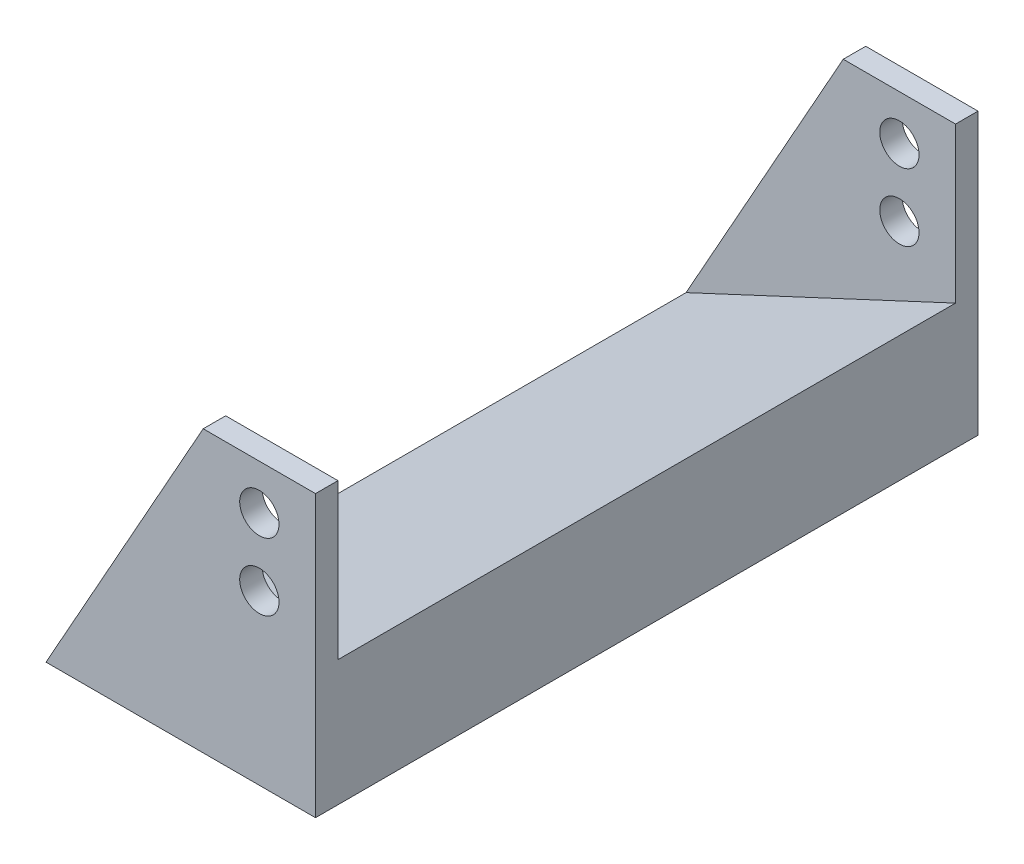
ISO-10303-21;
HEADER;
FILE_DESCRIPTION(('STEP AP214'),'2;1');
FILE_NAME('part.step','',(''),(''),'','','');
FILE_SCHEMA(('AUTOMOTIVE_DESIGN { 1 0 10303 214 1 1 1 1 }'));
ENDSEC;
DATA;
#1=APPLICATION_CONTEXT('core data for automotive mechanical design processes');
#2=APPLICATION_PROTOCOL_DEFINITION('international standard','automotive_design',2000,#1);
#3=PRODUCT_CONTEXT('',#1,'mechanical');
#4=PRODUCT('Part','Part','',(#3));
#5=PRODUCT_RELATED_PRODUCT_CATEGORY('part','',(#4));
#6=PRODUCT_DEFINITION_FORMATION('','',#4);
#7=PRODUCT_DEFINITION_CONTEXT('part definition',#1,'design');
#8=PRODUCT_DEFINITION('design','',#6,#7);
#9=PRODUCT_DEFINITION_SHAPE('','',#8);
#10=(LENGTH_UNIT() NAMED_UNIT(*) SI_UNIT(.MILLI.,.METRE.));
#11=(NAMED_UNIT(*) PLANE_ANGLE_UNIT() SI_UNIT($,.RADIAN.));
#12=(NAMED_UNIT(*) SI_UNIT($,.STERADIAN.) SOLID_ANGLE_UNIT());
#13=UNCERTAINTY_MEASURE_WITH_UNIT(LENGTH_MEASURE(1.E-05),#10,'distance_accuracy_value','');
#14=(GEOMETRIC_REPRESENTATION_CONTEXT(3) GLOBAL_UNCERTAINTY_ASSIGNED_CONTEXT((#13)) GLOBAL_UNIT_ASSIGNED_CONTEXT((#10,
#11,#12)) REPRESENTATION_CONTEXT('',''));
#15=CARTESIAN_POINT('',(0.,0.,0.));
#16=DIRECTION('',(0.,0.,1.));
#17=DIRECTION('',(1.,0.,0.));
#18=AXIS2_PLACEMENT_3D('',#15,#16,#17);
#19=CARTESIAN_POINT('',(24.,11.1913837957198,27.5));
#20=DIRECTION('',(0.422618261740694,-0.906307787036653,0.));
#21=DIRECTION('',(0.906307787036653,0.422618261740694,0.));
#22=AXIS2_PLACEMENT_3D('',#19,#20,#21);
#23=PLANE('',#22);
#24=DIRECTION('',(-0.906307787036653,-0.422618261740694,0.));
#25=VECTOR('',#24,1.);
#26=CARTESIAN_POINT('',(24.,11.1913837957198,-27.5));
#27=LINE('',#26,#25);
#28=CARTESIAN_POINT('',(24.,11.1913837957198,-27.5));
#29=VERTEX_POINT('',#28);
#30=CARTESIAN_POINT('',(0.,0.,-27.5));
#31=VERTEX_POINT('',#30);
#32=EDGE_CURVE('E174',#29,#31,#27,.T.);
#33=ORIENTED_EDGE('',*,*,#32,.T.);
#34=DIRECTION('',(0.,0.,-1.));
#35=VECTOR('',#34,1.);
#36=CARTESIAN_POINT('',(0.,0.,27.5));
#37=LINE('',#36,#35);
#38=CARTESIAN_POINT('',(0.,0.,27.5));
#39=VERTEX_POINT('',#38);
#40=EDGE_CURVE('E11',#39,#31,#37,.T.);
#41=ORIENTED_EDGE('',*,*,#40,.F.);
#42=DIRECTION('',(-0.906307787036653,-0.422618261740694,0.));
#43=VECTOR('',#42,1.);
#44=CARTESIAN_POINT('',(24.,11.1913837957198,27.5));
#45=LINE('',#44,#43);
#46=CARTESIAN_POINT('',(24.,11.1913837957198,27.5));
#47=VERTEX_POINT('',#46);
#48=EDGE_CURVE('E175',#47,#39,#45,.T.);
#49=ORIENTED_EDGE('',*,*,#48,.F.);
#50=DIRECTION('',(0.,0.,-1.));
#51=VECTOR('',#50,1.);
#52=CARTESIAN_POINT('',(24.,11.1913837957198,27.5));
#53=LINE('',#52,#51);
#54=EDGE_CURVE('E51',#47,#29,#53,.T.);
#55=ORIENTED_EDGE('',*,*,#54,.T.);
#56=EDGE_LOOP('',(#33,#41,#49,#55));
#57=FACE_BOUND('',#56,.T.);
#58=ADVANCED_FACE('F37',(#57),#23,.F.);
#59=CARTESIAN_POINT('',(0.,0.,27.5));
#60=DIRECTION('',(0.,1.,0.));
#61=DIRECTION('',(0.,0.,1.));
#62=AXIS2_PLACEMENT_3D('',#59,#60,#61);
#63=PLANE('',#62);
#64=ORIENTED_EDGE('',*,*,#40,.T.);
#65=DIRECTION('',(0.,0.,1.));
#66=VECTOR('',#65,1.);
#67=CARTESIAN_POINT('',(0.,0.,-29.5));
#68=LINE('',#67,#66);
#69=CARTESIAN_POINT('',(0.,0.,-29.5));
#70=VERTEX_POINT('',#69);
#71=EDGE_CURVE('E98',#70,#31,#68,.T.);
#72=ORIENTED_EDGE('',*,*,#71,.F.);
#73=DIRECTION('',(1.,0.,0.));
#74=VECTOR('',#73,1.);
#75=CARTESIAN_POINT('',(0.,0.,-29.5));
#76=LINE('',#75,#74);
#77=CARTESIAN_POINT('',(24.,0.,-29.5));
#78=VERTEX_POINT('',#77);
#79=EDGE_CURVE('E101',#70,#78,#76,.T.);
#80=ORIENTED_EDGE('',*,*,#79,.T.);
#81=DIRECTION('',(0.,0.,-1.));
#82=VECTOR('',#81,1.);
#83=CARTESIAN_POINT('',(24.,0.,27.5));
#84=LINE('',#83,#82);
#85=CARTESIAN_POINT('',(24.,0.,29.5));
#86=VERTEX_POINT('',#85);
#87=EDGE_CURVE('E45',#86,#78,#84,.T.);
#88=ORIENTED_EDGE('',*,*,#87,.F.);
#89=DIRECTION('',(1.,0.,0.));
#90=VECTOR('',#89,1.);
#91=CARTESIAN_POINT('',(0.,0.,29.5));
#92=LINE('',#91,#90);
#93=CARTESIAN_POINT('',(0.,0.,29.5));
#94=VERTEX_POINT('',#93);
#95=EDGE_CURVE('E151',#94,#86,#92,.T.);
#96=ORIENTED_EDGE('',*,*,#95,.F.);
#97=DIRECTION('',(0.,0.,-1.));
#98=VECTOR('',#97,1.);
#99=CARTESIAN_POINT('',(0.,0.,29.5));
#100=LINE('',#99,#98);
#101=EDGE_CURVE('E161',#94,#39,#100,.T.);
#102=ORIENTED_EDGE('',*,*,#101,.T.);
#103=EDGE_LOOP('',(#64,#72,#80,#88,#96,#102));
#104=FACE_BOUND('',#103,.T.);
#105=ADVANCED_FACE('F100',(#104),#63,.F.);
#106=CARTESIAN_POINT('',(24.,0.,27.5));
#107=DIRECTION('',(-1.,0.,0.));
#108=DIRECTION('',(0.,0.,1.));
#109=AXIS2_PLACEMENT_3D('',#106,#107,#108);
#110=PLANE('',#109);
#111=ORIENTED_EDGE('',*,*,#87,.T.);
#112=DIRECTION('',(0.,1.,0.));
#113=VECTOR('',#112,1.);
#114=CARTESIAN_POINT('',(24.,0.,-29.5));
#115=LINE('',#114,#113);
#116=CARTESIAN_POINT('',(24.,25.,-29.5));
#117=VERTEX_POINT('',#116);
#118=EDGE_CURVE('E118',#78,#117,#115,.T.);
#119=ORIENTED_EDGE('',*,*,#118,.T.);
#120=DIRECTION('',(0.,0.,1.));
#121=VECTOR('',#120,1.);
#122=CARTESIAN_POINT('',(24.,25.,-29.5));
#123=LINE('',#122,#121);
#124=CARTESIAN_POINT('',(24.,25.,-27.5));
#125=VERTEX_POINT('',#124);
#126=EDGE_CURVE('E128',#117,#125,#123,.T.);
#127=ORIENTED_EDGE('',*,*,#126,.T.);
#128=DIRECTION('',(0.,1.,0.));
#129=VECTOR('',#128,1.);
#130=CARTESIAN_POINT('',(24.,0.,-27.5));
#131=LINE('',#130,#129);
#132=EDGE_CURVE('E119',#29,#125,#131,.T.);
#133=ORIENTED_EDGE('',*,*,#132,.F.);
#134=ORIENTED_EDGE('',*,*,#54,.F.);
#135=DIRECTION('',(0.,1.,0.));
#136=VECTOR('',#135,1.);
#137=CARTESIAN_POINT('',(24.,0.,27.5));
#138=LINE('',#137,#136);
#139=CARTESIAN_POINT('',(24.,25.,27.5));
#140=VERTEX_POINT('',#139);
#141=EDGE_CURVE('E148',#47,#140,#138,.T.);
#142=ORIENTED_EDGE('',*,*,#141,.T.);
#143=DIRECTION('',(0.,0.,-1.));
#144=VECTOR('',#143,1.);
#145=CARTESIAN_POINT('',(24.,25.,29.5));
#146=LINE('',#145,#144);
#147=CARTESIAN_POINT('',(24.,25.,29.5));
#148=VERTEX_POINT('',#147);
#149=EDGE_CURVE('E171',#148,#140,#146,.T.);
#150=ORIENTED_EDGE('',*,*,#149,.F.);
#151=DIRECTION('',(0.,1.,0.));
#152=VECTOR('',#151,1.);
#153=CARTESIAN_POINT('',(24.,0.,29.5));
#154=LINE('',#153,#152);
#155=EDGE_CURVE('E154',#86,#148,#154,.T.);
#156=ORIENTED_EDGE('',*,*,#155,.F.);
#157=EDGE_LOOP('',(#111,#119,#127,#133,#134,#142,#150,#156));
#158=FACE_BOUND('',#157,.T.);
#159=ADVANCED_FACE('F180',(#158),#110,.F.);
#160=CARTESIAN_POINT('',(0.,0.,27.5));
#161=DIRECTION('',(0.,0.,1.));
#162=DIRECTION('',(1.,0.,0.));
#163=AXIS2_PLACEMENT_3D('',#160,#161,#162);
#164=PLANE('',#163);
#165=CARTESIAN_POINT('',(19.,21.,27.5));
#166=DIRECTION('',(0.,0.,1.));
#167=DIRECTION('',(1.,0.,0.));
#168=AXIS2_PLACEMENT_3D('',#165,#166,#167);
#169=CIRCLE('',#168,1.75);
#170=CARTESIAN_POINT('',(20.75,21.,27.5));
#171=VERTEX_POINT('',#170);
#172=EDGE_CURVE('E142',#171,#171,#169,.T.);
#173=ORIENTED_EDGE('',*,*,#172,.T.);
#174=EDGE_LOOP('',(#173));
#175=FACE_BOUND('',#174,.T.);
#176=CARTESIAN_POINT('',(19.,15.,27.5));
#177=DIRECTION('',(0.,0.,1.));
#178=DIRECTION('',(1.,0.,0.));
#179=AXIS2_PLACEMENT_3D('',#176,#177,#178);
#180=CIRCLE('',#179,1.75);
#181=CARTESIAN_POINT('',(20.75,15.,27.5));
#182=VERTEX_POINT('',#181);
#183=EDGE_CURVE('E108',#182,#182,#180,.T.);
#184=ORIENTED_EDGE('',*,*,#183,.T.);
#185=EDGE_LOOP('',(#184));
#186=FACE_BOUND('',#185,.T.);
#187=ORIENTED_EDGE('',*,*,#141,.F.);
#188=ORIENTED_EDGE('',*,*,#48,.T.);
#189=DIRECTION('',(-0.488603368931843,-0.87250601594972,0.));
#190=VECTOR('',#189,1.);
#191=CARTESIAN_POINT('',(14.,25.,27.5));
#192=LINE('',#191,#190);
#193=CARTESIAN_POINT('',(14.,25.,27.5));
#194=VERTEX_POINT('',#193);
#195=EDGE_CURVE('E155',#194,#39,#192,.T.);
#196=ORIENTED_EDGE('',*,*,#195,.F.);
#197=DIRECTION('',(-1.,0.,0.));
#198=VECTOR('',#197,1.);
#199=CARTESIAN_POINT('',(24.,25.,27.5));
#200=LINE('',#199,#198);
#201=EDGE_CURVE('E163',#140,#194,#200,.T.);
#202=ORIENTED_EDGE('',*,*,#201,.F.);
#203=EDGE_LOOP('',(#187,#188,#196,#202));
#204=FACE_BOUND('',#203,.T.);
#205=ADVANCED_FACE('F196',(#175,#186,#204),#164,.F.);
#206=CARTESIAN_POINT('',(0.,0.,29.5));
#207=DIRECTION('',(0.,0.,1.));
#208=DIRECTION('',(1.,0.,0.));
#209=AXIS2_PLACEMENT_3D('',#206,#207,#208);
#210=PLANE('',#209);
#211=CARTESIAN_POINT('',(19.,21.,29.5));
#212=DIRECTION('',(0.,0.,1.));
#213=DIRECTION('',(1.,0.,0.));
#214=AXIS2_PLACEMENT_3D('',#211,#212,#213);
#215=CIRCLE('',#214,1.75);
#216=CARTESIAN_POINT('',(20.75,21.,29.5));
#217=VERTEX_POINT('',#216);
#218=EDGE_CURVE('E145',#217,#217,#215,.T.);
#219=ORIENTED_EDGE('',*,*,#218,.F.);
#220=EDGE_LOOP('',(#219));
#221=FACE_BOUND('',#220,.T.);
#222=ORIENTED_EDGE('',*,*,#95,.T.);
#223=ORIENTED_EDGE('',*,*,#155,.T.);
#224=DIRECTION('',(-1.,0.,0.));
#225=VECTOR('',#224,1.);
#226=CARTESIAN_POINT('',(24.,25.,29.5));
#227=LINE('',#226,#225);
#228=CARTESIAN_POINT('',(14.,25.,29.5));
#229=VERTEX_POINT('',#228);
#230=EDGE_CURVE('E157',#148,#229,#227,.T.);
#231=ORIENTED_EDGE('',*,*,#230,.T.);
#232=DIRECTION('',(-0.488603368931843,-0.87250601594972,0.));
#233=VECTOR('',#232,1.);
#234=CARTESIAN_POINT('',(14.,25.,29.5));
#235=LINE('',#234,#233);
#236=EDGE_CURVE('E159',#229,#94,#235,.T.);
#237=ORIENTED_EDGE('',*,*,#236,.T.);
#238=EDGE_LOOP('',(#222,#223,#231,#237));
#239=FACE_BOUND('',#238,.T.);
#240=CARTESIAN_POINT('',(19.,15.,29.5));
#241=DIRECTION('',(0.,0.,1.));
#242=DIRECTION('',(1.,0.,0.));
#243=AXIS2_PLACEMENT_3D('',#240,#241,#242);
#244=CIRCLE('',#243,1.75);
#245=CARTESIAN_POINT('',(20.75,15.,29.5));
#246=VERTEX_POINT('',#245);
#247=EDGE_CURVE('E139',#246,#246,#244,.T.);
#248=ORIENTED_EDGE('',*,*,#247,.F.);
#249=EDGE_LOOP('',(#248));
#250=FACE_BOUND('',#249,.T.);
#251=ADVANCED_FACE('F185',(#221,#239,#250),#210,.T.);
#252=CARTESIAN_POINT('',(24.,25.,29.5));
#253=DIRECTION('',(0.,-1.,0.));
#254=DIRECTION('',(0.,0.,-1.));
#255=AXIS2_PLACEMENT_3D('',#252,#253,#254);
#256=PLANE('',#255);
#257=ORIENTED_EDGE('',*,*,#201,.T.);
#258=DIRECTION('',(0.,0.,-1.));
#259=VECTOR('',#258,1.);
#260=CARTESIAN_POINT('',(14.,25.,29.5));
#261=LINE('',#260,#259);
#262=EDGE_CURVE('E168',#229,#194,#261,.T.);
#263=ORIENTED_EDGE('',*,*,#262,.F.);
#264=ORIENTED_EDGE('',*,*,#230,.F.);
#265=ORIENTED_EDGE('',*,*,#149,.T.);
#266=EDGE_LOOP('',(#257,#263,#264,#265));
#267=FACE_BOUND('',#266,.T.);
#268=ADVANCED_FACE('F225',(#267),#256,.F.);
#269=CARTESIAN_POINT('',(14.,25.,29.5));
#270=DIRECTION('',(0.87250601594972,-0.488603368931843,0.));
#271=DIRECTION('',(0.488603368931843,0.87250601594972,0.));
#272=AXIS2_PLACEMENT_3D('',#269,#270,#271);
#273=PLANE('',#272);
#274=ORIENTED_EDGE('',*,*,#195,.T.);
#275=ORIENTED_EDGE('',*,*,#101,.F.);
#276=ORIENTED_EDGE('',*,*,#236,.F.);
#277=ORIENTED_EDGE('',*,*,#262,.T.);
#278=EDGE_LOOP('',(#274,#275,#276,#277));
#279=FACE_BOUND('',#278,.T.);
#280=ADVANCED_FACE('F191',(#279),#273,.F.);
#281=CARTESIAN_POINT('',(19.,21.,29.5));
#282=DIRECTION('',(0.,0.,-1.));
#283=DIRECTION('',(-1.,0.,0.));
#284=AXIS2_PLACEMENT_3D('',#281,#282,#283);
#285=CYLINDRICAL_SURFACE('',#284,1.75);
#286=ORIENTED_EDGE('',*,*,#218,.T.);
#287=EDGE_LOOP('',(#286));
#288=FACE_BOUND('',#287,.T.);
#289=ORIENTED_EDGE('',*,*,#172,.F.);
#290=EDGE_LOOP('',(#289));
#291=FACE_BOUND('',#290,.T.);
#292=ADVANCED_FACE('F231',(#288,#291),#285,.F.);
#293=CARTESIAN_POINT('',(19.,15.,29.5));
#294=DIRECTION('',(0.,0.,-1.));
#295=DIRECTION('',(-1.,0.,0.));
#296=AXIS2_PLACEMENT_3D('',#293,#294,#295);
#297=CYLINDRICAL_SURFACE('',#296,1.75);
#298=ORIENTED_EDGE('',*,*,#247,.T.);
#299=EDGE_LOOP('',(#298));
#300=FACE_BOUND('',#299,.T.);
#301=ORIENTED_EDGE('',*,*,#183,.F.);
#302=EDGE_LOOP('',(#301));
#303=FACE_BOUND('',#302,.T.);
#304=ADVANCED_FACE('F212',(#300,#303),#297,.F.);
#305=CARTESIAN_POINT('',(14.,25.,-29.5));
#306=DIRECTION('',(-0.87250601594972,0.488603368931843,0.));
#307=DIRECTION('',(-0.488603368931843,-0.87250601594972,0.));
#308=AXIS2_PLACEMENT_3D('',#305,#306,#307);
#309=PLANE('',#308);
#310=DIRECTION('',(-0.488603368931843,-0.87250601594972,0.));
#311=VECTOR('',#310,1.);
#312=CARTESIAN_POINT('',(14.,25.,-27.5));
#313=LINE('',#312,#311);
#314=CARTESIAN_POINT('',(14.,25.,-27.5));
#315=VERTEX_POINT('',#314);
#316=EDGE_CURVE('E129',#315,#31,#313,.T.);
#317=ORIENTED_EDGE('',*,*,#316,.F.);
#318=DIRECTION('',(0.,0.,1.));
#319=VECTOR('',#318,1.);
#320=CARTESIAN_POINT('',(14.,25.,-29.5));
#321=LINE('',#320,#319);
#322=CARTESIAN_POINT('',(14.,25.,-29.5));
#323=VERTEX_POINT('',#322);
#324=EDGE_CURVE('E109',#323,#315,#321,.T.);
#325=ORIENTED_EDGE('',*,*,#324,.F.);
#326=DIRECTION('',(-0.488603368931843,-0.87250601594972,0.));
#327=VECTOR('',#326,1.);
#328=CARTESIAN_POINT('',(14.,25.,-29.5));
#329=LINE('',#328,#327);
#330=EDGE_CURVE('E115',#323,#70,#329,.T.);
#331=ORIENTED_EDGE('',*,*,#330,.T.);
#332=ORIENTED_EDGE('',*,*,#71,.T.);
#333=EDGE_LOOP('',(#317,#325,#331,#332));
#334=FACE_BOUND('',#333,.T.);
#335=ADVANCED_FACE('F121',(#334),#309,.T.);
#336=CARTESIAN_POINT('',(24.,25.,-29.5));
#337=DIRECTION('',(0.,1.,0.));
#338=DIRECTION('',(0.,0.,1.));
#339=AXIS2_PLACEMENT_3D('',#336,#337,#338);
#340=PLANE('',#339);
#341=DIRECTION('',(-1.,0.,0.));
#342=VECTOR('',#341,1.);
#343=CARTESIAN_POINT('',(24.,25.,-27.5));
#344=LINE('',#343,#342);
#345=EDGE_CURVE('E131',#125,#315,#344,.T.);
#346=ORIENTED_EDGE('',*,*,#345,.F.);
#347=ORIENTED_EDGE('',*,*,#126,.F.);
#348=DIRECTION('',(-1.,0.,0.));
#349=VECTOR('',#348,1.);
#350=CARTESIAN_POINT('',(24.,25.,-29.5));
#351=LINE('',#350,#349);
#352=EDGE_CURVE('E122',#117,#323,#351,.T.);
#353=ORIENTED_EDGE('',*,*,#352,.T.);
#354=ORIENTED_EDGE('',*,*,#324,.T.);
#355=EDGE_LOOP('',(#346,#347,#353,#354));
#356=FACE_BOUND('',#355,.T.);
#357=ADVANCED_FACE('F203',(#356),#340,.T.);
#358=CARTESIAN_POINT('',(0.,0.,-29.5));
#359=DIRECTION('',(0.,0.,-1.));
#360=DIRECTION('',(1.,0.,0.));
#361=AXIS2_PLACEMENT_3D('',#358,#359,#360);
#362=PLANE('',#361);
#363=CARTESIAN_POINT('',(19.,15.,-29.5));
#364=DIRECTION('',(0.,0.,1.));
#365=DIRECTION('',(1.,0.,0.));
#366=AXIS2_PLACEMENT_3D('',#363,#364,#365);
#367=CIRCLE('',#366,1.75);
#368=CARTESIAN_POINT('',(20.75,15.,-29.5));
#369=VERTEX_POINT('',#368);
#370=EDGE_CURVE('E384',#369,#369,#367,.T.);
#371=ORIENTED_EDGE('',*,*,#370,.T.);
#372=EDGE_LOOP('',(#371));
#373=FACE_BOUND('',#372,.T.);
#374=CARTESIAN_POINT('',(19.,21.,-29.5));
#375=DIRECTION('',(0.,0.,1.));
#376=DIRECTION('',(1.,0.,0.));
#377=AXIS2_PLACEMENT_3D('',#374,#375,#376);
#378=CIRCLE('',#377,1.75);
#379=CARTESIAN_POINT('',(20.75,21.,-29.5));
#380=VERTEX_POINT('',#379);
#381=EDGE_CURVE('E132',#380,#380,#378,.T.);
#382=ORIENTED_EDGE('',*,*,#381,.T.);
#383=EDGE_LOOP('',(#382));
#384=FACE_BOUND('',#383,.T.);
#385=ORIENTED_EDGE('',*,*,#79,.F.);
#386=ORIENTED_EDGE('',*,*,#330,.F.);
#387=ORIENTED_EDGE('',*,*,#352,.F.);
#388=ORIENTED_EDGE('',*,*,#118,.F.);
#389=EDGE_LOOP('',(#385,#386,#387,#388));
#390=FACE_BOUND('',#389,.T.);
#391=ADVANCED_FACE('F113',(#373,#384,#390),#362,.T.);
#392=CARTESIAN_POINT('',(0.,0.,-27.5));
#393=DIRECTION('',(0.,0.,-1.));
#394=DIRECTION('',(1.,0.,0.));
#395=AXIS2_PLACEMENT_3D('',#392,#393,#394);
#396=PLANE('',#395);
#397=ORIENTED_EDGE('',*,*,#32,.F.);
#398=ORIENTED_EDGE('',*,*,#132,.T.);
#399=ORIENTED_EDGE('',*,*,#345,.T.);
#400=ORIENTED_EDGE('',*,*,#316,.T.);
#401=EDGE_LOOP('',(#397,#398,#399,#400));
#402=FACE_BOUND('',#401,.T.);
#403=CARTESIAN_POINT('',(19.,15.,-27.5));
#404=DIRECTION('',(0.,0.,1.));
#405=DIRECTION('',(1.,0.,0.));
#406=AXIS2_PLACEMENT_3D('',#403,#404,#405);
#407=CIRCLE('',#406,1.75);
#408=CARTESIAN_POINT('',(20.75,15.,-27.5));
#409=VERTEX_POINT('',#408);
#410=EDGE_CURVE('E387',#409,#409,#407,.T.);
#411=ORIENTED_EDGE('',*,*,#410,.F.);
#412=EDGE_LOOP('',(#411));
#413=FACE_BOUND('',#412,.T.);
#414=CARTESIAN_POINT('',(19.,21.,-27.5));
#415=DIRECTION('',(0.,0.,1.));
#416=DIRECTION('',(1.,0.,0.));
#417=AXIS2_PLACEMENT_3D('',#414,#415,#416);
#418=CIRCLE('',#417,1.75);
#419=CARTESIAN_POINT('',(20.75,21.,-27.5));
#420=VERTEX_POINT('',#419);
#421=EDGE_CURVE('E389',#420,#420,#418,.T.);
#422=ORIENTED_EDGE('',*,*,#421,.F.);
#423=EDGE_LOOP('',(#422));
#424=FACE_BOUND('',#423,.T.);
#425=ADVANCED_FACE('F199',(#402,#413,#424),#396,.F.);
#426=CARTESIAN_POINT('',(19.,21.,-29.5));
#427=DIRECTION('',(0.,0.,1.));
#428=DIRECTION('',(1.,0.,0.));
#429=AXIS2_PLACEMENT_3D('',#426,#427,#428);
#430=CYLINDRICAL_SURFACE('',#429,1.75);
#431=ORIENTED_EDGE('',*,*,#381,.F.);
#432=EDGE_LOOP('',(#431));
#433=FACE_BOUND('',#432,.T.);
#434=ORIENTED_EDGE('',*,*,#421,.T.);
#435=EDGE_LOOP('',(#434));
#436=FACE_BOUND('',#435,.T.);
#437=ADVANCED_FACE('F279',(#433,#436),#430,.F.);
#438=CARTESIAN_POINT('',(19.,15.,-29.5));
#439=DIRECTION('',(0.,0.,1.));
#440=DIRECTION('',(1.,0.,0.));
#441=AXIS2_PLACEMENT_3D('',#438,#439,#440);
#442=CYLINDRICAL_SURFACE('',#441,1.75);
#443=ORIENTED_EDGE('',*,*,#370,.F.);
#444=EDGE_LOOP('',(#443));
#445=FACE_BOUND('',#444,.T.);
#446=ORIENTED_EDGE('',*,*,#410,.T.);
#447=EDGE_LOOP('',(#446));
#448=FACE_BOUND('',#447,.T.);
#449=ADVANCED_FACE('F288',(#445,#448),#442,.F.);
#450=CLOSED_SHELL('',(#58,#105,#159,#205,#251,#268,#280,#292,#304,#335,#357,#391,#425,#437,#449));
#451=MANIFOLD_SOLID_BREP('B2',#450);
#452=ADVANCED_BREP_SHAPE_REPRESENTATION('',(#18,#451),#14);
#453=SHAPE_DEFINITION_REPRESENTATION(#9,#452);
ENDSEC;
END-ISO-10303-21;
